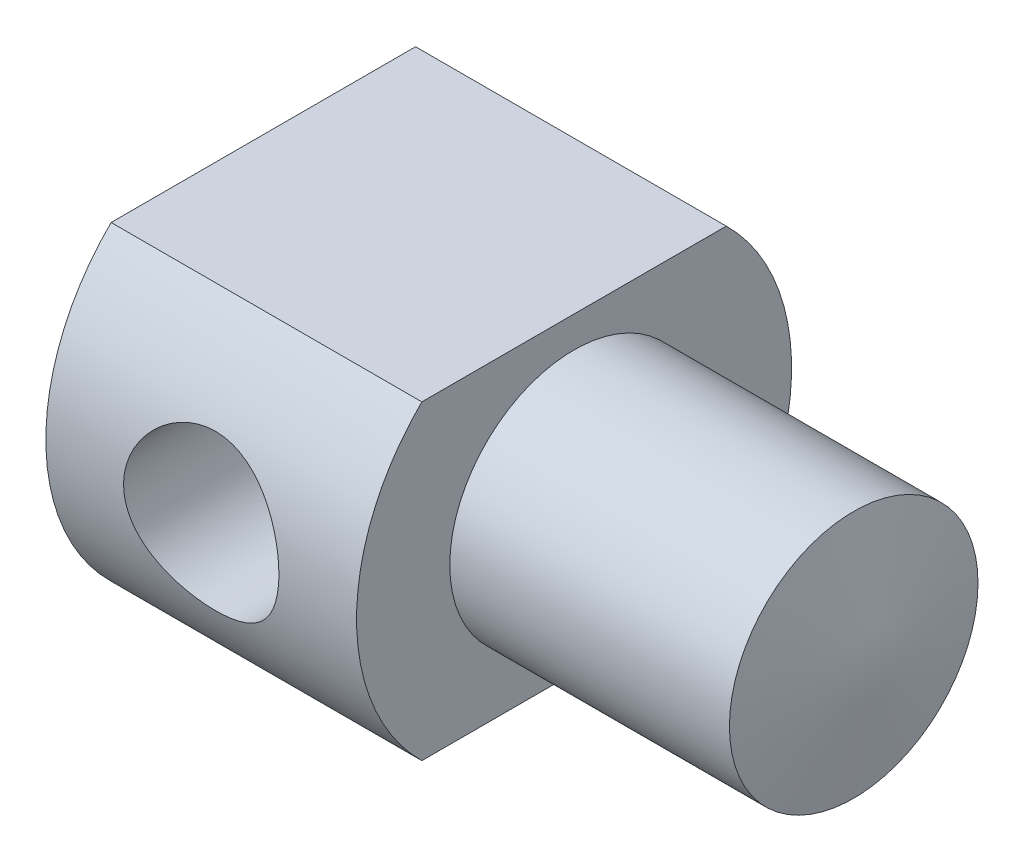
ISO-10303-21;
HEADER;
FILE_DESCRIPTION(('STEP AP214'),'2;1');
FILE_NAME('part.step','',(''),(''),'','','');
FILE_SCHEMA(('AUTOMOTIVE_DESIGN { 1 0 10303 214 1 1 1 1 }'));
ENDSEC;
DATA;
#1=APPLICATION_CONTEXT('core data for automotive mechanical design processes');
#2=APPLICATION_PROTOCOL_DEFINITION('international standard','automotive_design',2000,#1);
#3=PRODUCT_CONTEXT('',#1,'mechanical');
#4=PRODUCT('Part','Part','',(#3));
#5=PRODUCT_RELATED_PRODUCT_CATEGORY('part','',(#4));
#6=PRODUCT_DEFINITION_FORMATION('','',#4);
#7=PRODUCT_DEFINITION_CONTEXT('part definition',#1,'design');
#8=PRODUCT_DEFINITION('design','',#6,#7);
#9=PRODUCT_DEFINITION_SHAPE('','',#8);
#10=(LENGTH_UNIT() NAMED_UNIT(*) SI_UNIT(.MILLI.,.METRE.));
#11=(NAMED_UNIT(*) PLANE_ANGLE_UNIT() SI_UNIT($,.RADIAN.));
#12=(NAMED_UNIT(*) SI_UNIT($,.STERADIAN.) SOLID_ANGLE_UNIT());
#13=UNCERTAINTY_MEASURE_WITH_UNIT(LENGTH_MEASURE(1.E-05),#10,'distance_accuracy_value','');
#14=(GEOMETRIC_REPRESENTATION_CONTEXT(3) GLOBAL_UNCERTAINTY_ASSIGNED_CONTEXT((#13)) GLOBAL_UNIT_ASSIGNED_CONTEXT((#10,
#11,#12)) REPRESENTATION_CONTEXT('',''));
#15=CARTESIAN_POINT('',(0.,0.,0.));
#16=DIRECTION('',(0.,0.,1.));
#17=DIRECTION('',(1.,0.,0.));
#18=AXIS2_PLACEMENT_3D('',#15,#16,#17);
#19=CARTESIAN_POINT('',(0.,0.,0.));
#20=DIRECTION('',(1.,0.,0.));
#21=DIRECTION('',(0.,0.,-1.));
#22=AXIS2_PLACEMENT_3D('',#19,#20,#21);
#23=CYLINDRICAL_SURFACE('',#22,7.);
#24=DIRECTION('',(1.,0.,0.));
#25=VECTOR('',#24,1.);
#26=CARTESIAN_POINT('',(0.,5.,-4.89897948556636));
#27=LINE('',#26,#25);
#28=CARTESIAN_POINT('',(-9.70530792283388,5.,-4.89897948556636));
#29=VERTEX_POINT('',#28);
#30=CARTESIAN_POINT('',(-19.7053079228339,5.,-4.89897948556636));
#31=VERTEX_POINT('',#30);
#32=EDGE_CURVE('E59',#29,#31,#27,.F.);
#33=ORIENTED_EDGE('',*,*,#32,.F.);
#34=CARTESIAN_POINT('',(-9.70530792283388,0.,0.));
#35=DIRECTION('',(1.,0.,0.));
#36=DIRECTION('',(0.,0.,-1.));
#37=AXIS2_PLACEMENT_3D('',#34,#35,#36);
#38=CIRCLE('',#37,7.);
#39=CARTESIAN_POINT('',(-9.70530792283388,-5.,-4.89897948556636));
#40=VERTEX_POINT('',#39);
#41=EDGE_CURVE('E92',#40,#29,#38,.T.);
#42=ORIENTED_EDGE('',*,*,#41,.F.);
#43=DIRECTION('',(1.,0.,0.));
#44=VECTOR('',#43,1.);
#45=CARTESIAN_POINT('',(0.,-5.,-4.89897948556636));
#46=LINE('',#45,#44);
#47=CARTESIAN_POINT('',(-19.7053079228339,-5.,-4.89897948556635));
#48=VERTEX_POINT('',#47);
#49=EDGE_CURVE('E79',#48,#40,#46,.T.);
#50=ORIENTED_EDGE('',*,*,#49,.F.);
#51=CARTESIAN_POINT('',(-19.7053079228339,0.,0.));
#52=DIRECTION('',(1.,0.,0.));
#53=DIRECTION('',(0.,0.,-1.));
#54=AXIS2_PLACEMENT_3D('',#51,#52,#53);
#55=CIRCLE('',#54,7.);
#56=EDGE_CURVE('E90',#48,#31,#55,.T.);
#57=ORIENTED_EDGE('',*,*,#56,.T.);
#58=EDGE_LOOP('',(#33,#42,#50,#57));
#59=FACE_BOUND('',#58,.T.);
#60=CARTESIAN_POINT('',(-17.2053079228339,0.,-7.));
#61=CARTESIAN_POINT('',(-17.2053107468757,0.135839760518735,-7.0000020295295));
#62=CARTESIAN_POINT('',(-17.1942011656011,0.271659429947531,-6.99601056603649));
#63=CARTESIAN_POINT('',(-17.1502166356418,0.539264896606897,-6.98048404948616));
#64=CARTESIAN_POINT('',(-17.1173425177691,0.671050847614628,-6.96894928437749));
#65=CARTESIAN_POINT('',(-17.0311227815664,0.926692116674318,-6.93958109810981));
#66=CARTESIAN_POINT('',(-16.9778143631139,1.05056137145919,-6.92175912724346));
#67=CARTESIAN_POINT('',(-16.8524192034663,1.28759585298401,-6.88161078032354));
#68=CARTESIAN_POINT('',(-16.7803279633849,1.40075850640075,-6.85928332539979));
#69=CARTESIAN_POINT('',(-16.6164647907175,1.61758802805347,-6.81147377429754));
#70=CARTESIAN_POINT('',(-16.5240891918285,1.72078015672851,-6.78590827445072));
#71=CARTESIAN_POINT('',(-16.3235615590441,1.9105819932243,-6.73493522536265));
#72=CARTESIAN_POINT('',(-16.2154053391175,1.99718728701346,-6.70952771990194));
#73=CARTESIAN_POINT('',(-15.9819101300582,2.15423735561842,-6.6608007016897));
#74=CARTESIAN_POINT('',(-15.8561131793174,2.2240352979483,-6.63758107761794));
#75=CARTESIAN_POINT('',(-15.5936042581295,2.34127572230003,-6.59714352451506));
#76=CARTESIAN_POINT('',(-15.4568962082662,2.38872619231546,-6.57992345154766));
#77=CARTESIAN_POINT('',(-15.1818850866314,2.45809130448528,-6.55432038222057));
#78=CARTESIAN_POINT('',(-15.0438386158908,2.48090519407331,-6.54562733379002));
#79=CARTESIAN_POINT('',(-14.7656242910101,2.5031615222748,-6.53715061879806));
#80=CARTESIAN_POINT('',(-14.6254572302923,2.50261249605974,-6.53736369856128));
#81=CARTESIAN_POINT('',(-14.3549522677814,2.4788507897233,-6.54640588297195));
#82=CARTESIAN_POINT('',(-14.2244895698341,2.45685161763648,-6.5547736366904));
#83=CARTESIAN_POINT('',(-13.9692463956505,2.3928085105506,-6.57842082174383));
#84=CARTESIAN_POINT('',(-13.8444666981831,2.35076183734613,-6.59370119723067));
#85=CARTESIAN_POINT('',(-13.6015341770482,2.247095668441,-6.62975170487814));
#86=CARTESIAN_POINT('',(-13.4835383201753,2.18514195933256,-6.65061447775042));
#87=CARTESIAN_POINT('',(-13.2592515361842,2.04365272690694,-6.69544469696369));
#88=CARTESIAN_POINT('',(-13.1529643895265,1.96411154980232,-6.71941314064672));
#89=CARTESIAN_POINT('',(-12.9483483314627,1.78403149047107,-6.76952498465894));
#90=CARTESIAN_POINT('',(-12.8508900635847,1.68251331515438,-6.79571223474351));
#91=CARTESIAN_POINT('',(-12.6741362399991,1.46426184534914,-6.84605473605516));
#92=CARTESIAN_POINT('',(-12.5948429805351,1.34752663019369,-6.87020973014028));
#93=CARTESIAN_POINT('',(-12.4558273128947,1.10010034292175,-6.91416998722002));
#94=CARTESIAN_POINT('',(-12.3963696829441,0.969249112425205,-6.93391532170415));
#95=CARTESIAN_POINT('',(-12.3005920986735,0.698523468127243,-6.96639167687355));
#96=CARTESIAN_POINT('',(-12.2642628620712,0.558652699053762,-6.97912551125635));
#97=CARTESIAN_POINT('',(-12.2173887721743,0.281205091813829,-6.99566202632136));
#98=CARTESIAN_POINT('',(-12.2056697920882,0.143850613169088,-6.99987103999093));
#99=CARTESIAN_POINT('',(-12.2049628008437,-0.130909371573398,-7.00012297890716));
#100=CARTESIAN_POINT('',(-12.2159702958421,-0.268314862212675,-6.99616751856457));
#101=CARTESIAN_POINT('',(-12.2594940601555,-0.534368698997773,-6.98080349995239));
#102=CARTESIAN_POINT('',(-12.291262678632,-0.663155848081404,-6.96965417819419));
#103=CARTESIAN_POINT('',(-12.3744445175699,-0.913499444029997,-6.94128245796679));
#104=CARTESIAN_POINT('',(-12.4258602886625,-1.03505494970017,-6.9240592709991));
#105=CARTESIAN_POINT('',(-12.5484667762355,-1.27131790851501,-6.88465739573328));
#106=CARTESIAN_POINT('',(-12.6201744033332,-1.38573546298722,-6.86235262462323));
#107=CARTESIAN_POINT('',(-12.7807354179413,-1.60127936897371,-6.81528395513799));
#108=CARTESIAN_POINT('',(-12.8695946876077,-1.70240114063959,-6.79051921453452));
#109=CARTESIAN_POINT('',(-13.0674375555628,-1.89402292059753,-6.73966040960453));
#110=CARTESIAN_POINT('',(-13.1772326358536,-1.9836868190697,-6.71356479866296));
#111=CARTESIAN_POINT('',(-13.4108491928382,-2.14345525781599,-6.6642787599771));
#112=CARTESIAN_POINT('',(-13.5346713539625,-2.21355884309556,-6.64108847411013));
#113=CARTESIAN_POINT('',(-13.7933727320699,-2.33208686094212,-6.60040332956606));
#114=CARTESIAN_POINT('',(-13.9282635933437,-2.3804881075604,-6.58291456759544));
#115=CARTESIAN_POINT('',(-14.205068023554,-2.45361419016748,-6.55601442004241));
#116=CARTESIAN_POINT('',(-14.3469777434962,-2.4783518546378,-6.54659865821928));
#117=CARTESIAN_POINT('',(-14.6248284022069,-2.50236255506863,-6.53745596427834));
#118=CARTESIAN_POINT('',(-14.7606311372583,-2.50304426978182,-6.53719306756498));
#119=CARTESIAN_POINT('',(-15.0303055934888,-2.48247035008869,-6.54503319463772));
#120=CARTESIAN_POINT('',(-15.164177464082,-2.46121642244208,-6.55313556754228));
#121=CARTESIAN_POINT('',(-15.4228085082057,-2.39843007607193,-6.57636700427785));
#122=CARTESIAN_POINT('',(-15.5477120218397,-2.35741961008936,-6.59131474248996));
#123=CARTESIAN_POINT('',(-15.7889506047008,-2.25672644338171,-6.62646329315119));
#124=CARTESIAN_POINT('',(-15.9052836037781,-2.19703924956895,-6.64666536944648));
#125=CARTESIAN_POINT('',(-16.1322336727861,-2.05730313071904,-6.69127230994833));
#126=CARTESIAN_POINT('',(-16.2422959636968,-1.97640371595173,-6.71583400336863));
#127=CARTESIAN_POINT('',(-16.4477354274944,-1.79790863011924,-6.76580411328317));
#128=CARTESIAN_POINT('',(-16.5431081431849,-1.70030791033581,-6.79121278393859));
#129=CARTESIAN_POINT('',(-16.7210298256504,-1.48566252339524,-6.84145445667706));
#130=CARTESIAN_POINT('',(-16.8027609626248,-1.36791750616704,-6.86620367070764));
#131=CARTESIAN_POINT('',(-16.9452155866718,-1.11951131249464,-6.91104924401846));
#132=CARTESIAN_POINT('',(-17.0059406630366,-0.988851114158935,-6.93114595526313));
#133=CARTESIAN_POINT('',(-17.1044482331425,-0.717646336524983,-6.96446006180833));
#134=CARTESIAN_POINT('',(-17.1421333309965,-0.577062560467784,-6.97764821973896));
#135=CARTESIAN_POINT('',(-17.1925567974727,-0.290976881134822,-6.99541542277591));
#136=CARTESIAN_POINT('',(-17.2053048984402,-0.145476919097827,-6.99999782648543));
#137=CARTESIAN_POINT('',(-17.2053079228339,0.,-7.));
#138=B_SPLINE_CURVE_WITH_KNOTS('',3,(#60,#61,#62,#63,#64,#65,#66,#67,#68,#69,#70,#71,#72,#73,
#74,#75,#76,#77,#78,#79,#80,#81,#82,#83,#84,#85,#86,#87,#88,#89,#90,#91,#92,#93,#94,#95,#96,#97,
#98,#99,#100,#101,#102,#103,#104,#105,#106,#107,#108,#109,#110,#111,#112,#113,#114,#115,#116,
#117,#118,#119,#120,#121,#122,#123,#124,#125,#126,#127,#128,#129,#130,#131,#132,#133,#134,#135,
#136,#137),.UNSPECIFIED.,.T.,.F.,(4,2,2,2,2,2,2,2,2,2,2,2,2,2,2,2,2,2,2,2,2,2,2,2,2,2,2,2,2,2,2,
2,2,2,2,2,2,2,4),(0.,0.406983217142954,0.813950899519932,1.22018120425629,1.62650889940498,
2.04714572459521,2.46789433314937,2.90289606780334,3.3377421950035,3.75611562378725,
4.17433620956451,4.57019246497947,4.96610280426156,5.36904149669468,5.77210990935867,
6.19956653135137,6.62707715847137,7.06008524763626,7.49291944485573,7.90458529912081,
8.31616976000826,8.71369326802826,9.11126840085791,9.52005856953122,9.92898918269314,
10.3593838463852,10.7897995195909,11.2206739431307,11.6513146487842,12.0566930957309,
12.4620400035307,12.8572208236401,13.2524967861626,13.6670344525245,14.0816976535747,
14.5159343578492,14.9501382011315,15.3861650682914,15.8220217300551),.UNSPECIFIED.);
#139=CARTESIAN_POINT('',(-17.2053079228339,0.,-7.));
#140=VERTEX_POINT('',#139);
#141=EDGE_CURVE('E96',#140,#140,#138,.T.);
#142=ORIENTED_EDGE('',*,*,#141,.F.);
#143=EDGE_LOOP('',(#142));
#144=FACE_BOUND('',#143,.T.);
#145=ADVANCED_FACE('F37',(#59,#144),#23,.T.);
#146=CARTESIAN_POINT('',(0.,0.,0.));
#147=DIRECTION('',(-1.,0.,0.));
#148=DIRECTION('',(0.,0.,1.));
#149=AXIS2_PLACEMENT_3D('',#146,#147,#148);
#150=CONICAL_SURFACE('',#149,0.,1.39626340159546);
#151=CARTESIAN_POINT('',(-0.705307922833878,0.,0.));
#152=DIRECTION('',(1.,0.,0.));
#153=DIRECTION('',(0.,0.,-1.));
#154=AXIS2_PLACEMENT_3D('',#151,#152,#153);
#155=CIRCLE('',#154,4.);
#156=CARTESIAN_POINT('',(-0.705307922833878,0.,-4.));
#157=VERTEX_POINT('',#156);
#158=EDGE_CURVE('E85',#157,#157,#155,.T.);
#159=ORIENTED_EDGE('',*,*,#158,.T.);
#160=EDGE_LOOP('',(#159));
#161=FACE_BOUND('',#160,.T.);
#162=CARTESIAN_POINT('',(0.,0.,0.));
#163=VERTEX_POINT('',#162);
#164=VERTEX_LOOP('',#163);
#165=FACE_BOUND('',#164,.T.);
#166=ADVANCED_FACE('F39',(#161,#165),#150,.T.);
#167=CARTESIAN_POINT('',(0.,0.,0.));
#168=DIRECTION('',(1.,0.,0.));
#169=DIRECTION('',(0.,0.,-1.));
#170=AXIS2_PLACEMENT_3D('',#167,#168,#169);
#171=CYLINDRICAL_SURFACE('',#170,4.);
#172=CARTESIAN_POINT('',(-9.70530792283388,0.,0.));
#173=DIRECTION('',(1.,0.,0.));
#174=DIRECTION('',(0.,0.,-1.));
#175=AXIS2_PLACEMENT_3D('',#172,#173,#174);
#176=CIRCLE('',#175,4.);
#177=CARTESIAN_POINT('',(-9.70530792283388,0.,-4.));
#178=VERTEX_POINT('',#177);
#179=EDGE_CURVE('E107',#178,#178,#176,.T.);
#180=ORIENTED_EDGE('',*,*,#179,.T.);
#181=EDGE_LOOP('',(#180));
#182=FACE_BOUND('',#181,.T.);
#183=ORIENTED_EDGE('',*,*,#158,.F.);
#184=EDGE_LOOP('',(#183));
#185=FACE_BOUND('',#184,.T.);
#186=ADVANCED_FACE('F140',(#182,#185),#171,.T.);
#187=CARTESIAN_POINT('',(-9.70530792283388,4.,0.));
#188=DIRECTION('',(1.,0.,0.));
#189=DIRECTION('',(0.,0.,-1.));
#190=AXIS2_PLACEMENT_3D('',#187,#188,#189);
#191=PLANE('',#190);
#192=DIRECTION('',(0.,0.,-1.));
#193=VECTOR('',#192,1.);
#194=CARTESIAN_POINT('',(-9.70530792283388,5.,0.));
#195=LINE('',#194,#193);
#196=CARTESIAN_POINT('',(-9.70530792283388,5.,4.89897948556636));
#197=VERTEX_POINT('',#196);
#198=EDGE_CURVE('E103',#197,#29,#195,.T.);
#199=ORIENTED_EDGE('',*,*,#198,.F.);
#200=CARTESIAN_POINT('',(-9.70530792283388,-5.,4.89897948556636));
#201=VERTEX_POINT('',#200);
#202=EDGE_CURVE('E106',#197,#201,#38,.T.);
#203=ORIENTED_EDGE('',*,*,#202,.T.);
#204=DIRECTION('',(0.,0.,1.));
#205=VECTOR('',#204,1.);
#206=CARTESIAN_POINT('',(-9.70530792283388,-5.,0.));
#207=LINE('',#206,#205);
#208=EDGE_CURVE('E163',#40,#201,#207,.T.);
#209=ORIENTED_EDGE('',*,*,#208,.F.);
#210=ORIENTED_EDGE('',*,*,#41,.T.);
#211=EDGE_LOOP('',(#199,#203,#209,#210));
#212=FACE_BOUND('',#211,.T.);
#213=ORIENTED_EDGE('',*,*,#179,.F.);
#214=EDGE_LOOP('',(#213));
#215=FACE_BOUND('',#214,.T.);
#216=ADVANCED_FACE('F134',(#212,#215),#191,.T.);
#217=DIRECTION('',(1.,0.,0.));
#218=VECTOR('',#217,1.);
#219=CARTESIAN_POINT('',(0.,5.,4.89897948556636));
#220=LINE('',#219,#218);
#221=CARTESIAN_POINT('',(-19.7053079228339,5.,4.89897948556636));
#222=VERTEX_POINT('',#221);
#223=EDGE_CURVE('E162',#222,#197,#220,.T.);
#224=ORIENTED_EDGE('',*,*,#223,.F.);
#225=CARTESIAN_POINT('',(-19.7053079228339,-5.,4.89897948556635));
#226=VERTEX_POINT('',#225);
#227=EDGE_CURVE('E95',#222,#226,#55,.T.);
#228=ORIENTED_EDGE('',*,*,#227,.T.);
#229=DIRECTION('',(1.,0.,0.));
#230=VECTOR('',#229,1.);
#231=CARTESIAN_POINT('',(0.,-5.,4.89897948556636));
#232=LINE('',#231,#230);
#233=EDGE_CURVE('E52',#201,#226,#232,.F.);
#234=ORIENTED_EDGE('',*,*,#233,.F.);
#235=ORIENTED_EDGE('',*,*,#202,.F.);
#236=EDGE_LOOP('',(#224,#228,#234,#235));
#237=FACE_BOUND('',#236,.T.);
#238=CARTESIAN_POINT('',(-12.2053079228339,0.,7.));
#239=CARTESIAN_POINT('',(-12.205305098792,0.135839760518733,7.0000020295295));
#240=CARTESIAN_POINT('',(-12.2164146800667,0.271659429947529,6.99601056603649));
#241=CARTESIAN_POINT('',(-12.2603992100259,0.539264896606895,6.98048404948617));
#242=CARTESIAN_POINT('',(-12.2932733278987,0.671050847614626,6.96894928437749));
#243=CARTESIAN_POINT('',(-12.3794930641013,0.926692116674315,6.93958109810981));
#244=CARTESIAN_POINT('',(-12.4328014825538,1.05056137145919,6.92175912724346));
#245=CARTESIAN_POINT('',(-12.5581966422015,1.28759585298401,6.88161078032354));
#246=CARTESIAN_POINT('',(-12.6302878822829,1.40075850640075,6.85928332539979));
#247=CARTESIAN_POINT('',(-12.7941510549503,1.61758802805346,6.81147377429754));
#248=CARTESIAN_POINT('',(-12.8865266538392,1.72078015672851,6.78590827445072));
#249=CARTESIAN_POINT('',(-13.0870542866237,1.9105819932243,6.73493522536265));
#250=CARTESIAN_POINT('',(-13.1952105065503,1.99718728701346,6.70952771990194));
#251=CARTESIAN_POINT('',(-13.4287057156096,2.15423735561842,6.6608007016897));
#252=CARTESIAN_POINT('',(-13.5545026663504,2.2240352979483,6.63758107761794));
#253=CARTESIAN_POINT('',(-13.8170115875382,2.34127572230002,6.59714352451506));
#254=CARTESIAN_POINT('',(-13.9537196374016,2.38872619231546,6.57992345154766));
#255=CARTESIAN_POINT('',(-14.2287307590363,2.45809130448528,6.55432038222057));
#256=CARTESIAN_POINT('',(-14.366777229777,2.48090519407331,6.54562733379002));
#257=CARTESIAN_POINT('',(-14.6449915546577,2.5031615222748,6.53715061879806));
#258=CARTESIAN_POINT('',(-14.7851586153754,2.50261249605974,6.53736369856128));
#259=CARTESIAN_POINT('',(-15.0556635778864,2.4788507897233,6.54640588297195));
#260=CARTESIAN_POINT('',(-15.1861262758336,2.45685161763648,6.5547736366904));
#261=CARTESIAN_POINT('',(-15.4413694500172,2.3928085105506,6.57842082174383));
#262=CARTESIAN_POINT('',(-15.5661491474847,2.35076183734613,6.59370119723068));
#263=CARTESIAN_POINT('',(-15.8090816686196,2.247095668441,6.62975170487814));
#264=CARTESIAN_POINT('',(-15.9270775254924,2.18514195933256,6.65061447775042));
#265=CARTESIAN_POINT('',(-16.1513643094836,2.04365272690694,6.69544469696369));
#266=CARTESIAN_POINT('',(-16.2576514561413,1.96411154980232,6.71941314064672));
#267=CARTESIAN_POINT('',(-16.462267514205,1.78403149047107,6.76952498465894));
#268=CARTESIAN_POINT('',(-16.559725782083,1.68251331515438,6.79571223474351));
#269=CARTESIAN_POINT('',(-16.7364796056687,1.46426184534914,6.84605473605516));
#270=CARTESIAN_POINT('',(-16.8157728651326,1.3475266301937,6.87020973014028));
#271=CARTESIAN_POINT('',(-16.9547885327731,1.10010034292175,6.91416998722002));
#272=CARTESIAN_POINT('',(-17.0142461627237,0.969249112425207,6.93391532170415));
#273=CARTESIAN_POINT('',(-17.1100237469942,0.698523468127245,6.96639167687355));
#274=CARTESIAN_POINT('',(-17.1463529835965,0.558652699053764,6.97912551125635));
#275=CARTESIAN_POINT('',(-17.1932270734935,0.28120509181383,6.99566202632136));
#276=CARTESIAN_POINT('',(-17.2049460535795,0.14385061316909,6.99987103999093));
#277=CARTESIAN_POINT('',(-17.2056530448241,-0.130909371573396,7.00012297890716));
#278=CARTESIAN_POINT('',(-17.1946455498257,-0.268314862212673,6.99616751856457));
#279=CARTESIAN_POINT('',(-17.1511217855123,-0.534368698997772,6.98080349995239));
#280=CARTESIAN_POINT('',(-17.1193531670357,-0.663155848081402,6.96965417819419));
#281=CARTESIAN_POINT('',(-17.0361713280978,-0.913499444029996,6.94128245796679));
#282=CARTESIAN_POINT('',(-16.9847555570053,-1.03505494970017,6.9240592709991));
#283=CARTESIAN_POINT('',(-16.8621490694323,-1.27131790851501,6.88465739573328));
#284=CARTESIAN_POINT('',(-16.7904414423345,-1.38573546298722,6.86235262462324));
#285=CARTESIAN_POINT('',(-16.6298804277264,-1.60127936897371,6.81528395513799));
#286=CARTESIAN_POINT('',(-16.54102115806,-1.70240114063959,6.79051921453452));
#287=CARTESIAN_POINT('',(-16.343178290105,-1.89402292059753,6.73966040960453));
#288=CARTESIAN_POINT('',(-16.2333832098142,-1.9836868190697,6.71356479866296));
#289=CARTESIAN_POINT('',(-15.9997666528295,-2.14345525781599,6.6642787599771));
#290=CARTESIAN_POINT('',(-15.8759444917053,-2.21355884309556,6.64108847411014));
#291=CARTESIAN_POINT('',(-15.6172431135978,-2.33208686094212,6.60040332956607));
#292=CARTESIAN_POINT('',(-15.482352252324,-2.3804881075604,6.58291456759544));
#293=CARTESIAN_POINT('',(-15.2055478221138,-2.45361419016748,6.55601442004241));
#294=CARTESIAN_POINT('',(-15.0636381021716,-2.4783518546378,6.54659865821929));
#295=CARTESIAN_POINT('',(-14.7857874434609,-2.50236255506863,6.53745596427834));
#296=CARTESIAN_POINT('',(-14.6499847084095,-2.50304426978182,6.53719306756498));
#297=CARTESIAN_POINT('',(-14.380310252179,-2.48247035008869,6.54503319463772));
#298=CARTESIAN_POINT('',(-14.2464383815857,-2.46121642244208,6.55313556754228));
#299=CARTESIAN_POINT('',(-13.987807337462,-2.39843007607193,6.57636700427785));
#300=CARTESIAN_POINT('',(-13.8629038238281,-2.35741961008936,6.59131474248996));
#301=CARTESIAN_POINT('',(-13.621665240967,-2.25672644338171,6.62646329315119));
#302=CARTESIAN_POINT('',(-13.5053322418897,-2.19703924956895,6.64666536944648));
#303=CARTESIAN_POINT('',(-13.2783821728816,-2.05730313071905,6.69127230994833));
#304=CARTESIAN_POINT('',(-13.168319881971,-1.97640371595173,6.71583400336863));
#305=CARTESIAN_POINT('',(-12.9628804181734,-1.79790863011924,6.76580411328317));
#306=CARTESIAN_POINT('',(-12.8675077024829,-1.70030791033582,6.79121278393859));
#307=CARTESIAN_POINT('',(-12.6895860200173,-1.48566252339525,6.84145445667706));
#308=CARTESIAN_POINT('',(-12.607854883043,-1.36791750616705,6.86620367070764));
#309=CARTESIAN_POINT('',(-12.465400258996,-1.11951131249464,6.91104924401846));
#310=CARTESIAN_POINT('',(-12.4046751826312,-0.988851114158939,6.93114595526313));
#311=CARTESIAN_POINT('',(-12.3061676125253,-0.717646336524986,6.96446006180833));
#312=CARTESIAN_POINT('',(-12.2684825146712,-0.577062560467787,6.97764821973896));
#313=CARTESIAN_POINT('',(-12.2180590481951,-0.290976881134824,6.99541542277591));
#314=CARTESIAN_POINT('',(-12.2053109472275,-0.145476919097829,6.99999782648543));
#315=CARTESIAN_POINT('',(-12.2053079228339,0.,7.));
#316=B_SPLINE_CURVE_WITH_KNOTS('',3,(#238,#239,#240,#241,#242,#243,#244,#245,#246,#247,#248,
#249,#250,#251,#252,#253,#254,#255,#256,#257,#258,#259,#260,#261,#262,#263,#264,#265,#266,#267,
#268,#269,#270,#271,#272,#273,#274,#275,#276,#277,#278,#279,#280,#281,#282,#283,#284,#285,#286,
#287,#288,#289,#290,#291,#292,#293,#294,#295,#296,#297,#298,#299,#300,#301,#302,#303,#304,#305,
#306,#307,#308,#309,#310,#311,#312,#313,#314,#315),.UNSPECIFIED.,.T.,.F.,(4,2,2,2,2,2,2,2,2,2,2,
2,2,2,2,2,2,2,2,2,2,2,2,2,2,2,2,2,2,2,2,2,2,2,2,2,2,2,4),(0.,0.406983217142953,
0.813950899519932,1.22018120425629,1.62650889940498,2.04714572459521,2.46789433314937,
2.90289606780334,3.3377421950035,3.75611562378725,4.17433620956452,4.57019246497947,
4.96610280426156,5.36904149669469,5.77210990935867,6.19956653135137,6.62707715847137,
7.06008524763626,7.49291944485573,7.90458529912081,8.31616976000826,8.71369326802826,
9.11126840085791,9.52005856953122,9.92898918269314,10.3593838463852,10.7897995195909,
11.2206739431307,11.6513146487841,12.0566930957309,12.4620400035307,12.8572208236401,
13.2524967861626,13.6670344525245,14.0816976535747,14.5159343578492,14.9501382011315,
15.3861650682914,15.8220217300551),.UNSPECIFIED.);
#317=CARTESIAN_POINT('',(-12.2053079228339,0.,7.));
#318=VERTEX_POINT('',#317);
#319=EDGE_CURVE('E99',#318,#318,#316,.T.);
#320=ORIENTED_EDGE('',*,*,#319,.F.);
#321=EDGE_LOOP('',(#320));
#322=FACE_BOUND('',#321,.T.);
#323=ADVANCED_FACE('F119',(#237,#322),#23,.T.);
#324=CARTESIAN_POINT('',(-19.7053079228339,7.,0.));
#325=DIRECTION('',(-1.,0.,0.));
#326=DIRECTION('',(0.,0.,1.));
#327=AXIS2_PLACEMENT_3D('',#324,#325,#326);
#328=PLANE('',#327);
#329=DIRECTION('',(0.,0.,1.));
#330=VECTOR('',#329,1.);
#331=CARTESIAN_POINT('',(-19.7053079228339,5.,0.));
#332=LINE('',#331,#330);
#333=EDGE_CURVE('E11',#31,#222,#332,.T.);
#334=ORIENTED_EDGE('',*,*,#333,.F.);
#335=ORIENTED_EDGE('',*,*,#56,.F.);
#336=DIRECTION('',(0.,0.,-1.));
#337=VECTOR('',#336,1.);
#338=CARTESIAN_POINT('',(-19.7053079228339,-5.,0.));
#339=LINE('',#338,#337);
#340=EDGE_CURVE('E45',#226,#48,#339,.T.);
#341=ORIENTED_EDGE('',*,*,#340,.F.);
#342=ORIENTED_EDGE('',*,*,#227,.F.);
#343=EDGE_LOOP('',(#334,#335,#341,#342));
#344=FACE_BOUND('',#343,.T.);
#345=ADVANCED_FACE('F94',(#344),#328,.T.);
#346=CARTESIAN_POINT('',(-14.7053079228339,0.,-15.));
#347=DIRECTION('',(0.,0.,1.));
#348=DIRECTION('',(1.,0.,0.));
#349=AXIS2_PLACEMENT_3D('',#346,#347,#348);
#350=CYLINDRICAL_SURFACE('',#349,2.5);
#351=ORIENTED_EDGE('',*,*,#141,.T.);
#352=EDGE_LOOP('',(#351));
#353=FACE_BOUND('',#352,.T.);
#354=ORIENTED_EDGE('',*,*,#319,.T.);
#355=EDGE_LOOP('',(#354));
#356=FACE_BOUND('',#355,.T.);
#357=ADVANCED_FACE('F123',(#353,#356),#350,.F.);
#358=CARTESIAN_POINT('',(-21.803077660984,-5.,-15.));
#359=DIRECTION('',(0.,1.,0.));
#360=DIRECTION('',(-1.,0.,0.));
#361=AXIS2_PLACEMENT_3D('',#358,#359,#360);
#362=PLANE('',#361);
#363=ORIENTED_EDGE('',*,*,#208,.T.);
#364=ORIENTED_EDGE('',*,*,#233,.T.);
#365=ORIENTED_EDGE('',*,*,#340,.T.);
#366=ORIENTED_EDGE('',*,*,#49,.T.);
#367=EDGE_LOOP('',(#363,#364,#365,#366));
#368=FACE_BOUND('',#367,.T.);
#369=ADVANCED_FACE('F78',(#368),#362,.F.);
#370=CARTESIAN_POINT('',(-21.803077660984,5.,-15.));
#371=DIRECTION('',(0.,-1.,0.));
#372=DIRECTION('',(0.,0.,-1.));
#373=AXIS2_PLACEMENT_3D('',#370,#371,#372);
#374=PLANE('',#373);
#375=ORIENTED_EDGE('',*,*,#198,.T.);
#376=ORIENTED_EDGE('',*,*,#32,.T.);
#377=ORIENTED_EDGE('',*,*,#333,.T.);
#378=ORIENTED_EDGE('',*,*,#223,.T.);
#379=EDGE_LOOP('',(#375,#376,#377,#378));
#380=FACE_BOUND('',#379,.T.);
#381=ADVANCED_FACE('F167',(#380),#374,.F.);
#382=CLOSED_SHELL('',(#145,#166,#186,#216,#323,#345,#357,#369,#381));
#383=MANIFOLD_SOLID_BREP('B2',#382);
#384=ADVANCED_BREP_SHAPE_REPRESENTATION('',(#18,#383),#14);
#385=SHAPE_DEFINITION_REPRESENTATION(#9,#384);
ENDSEC;
END-ISO-10303-21;
